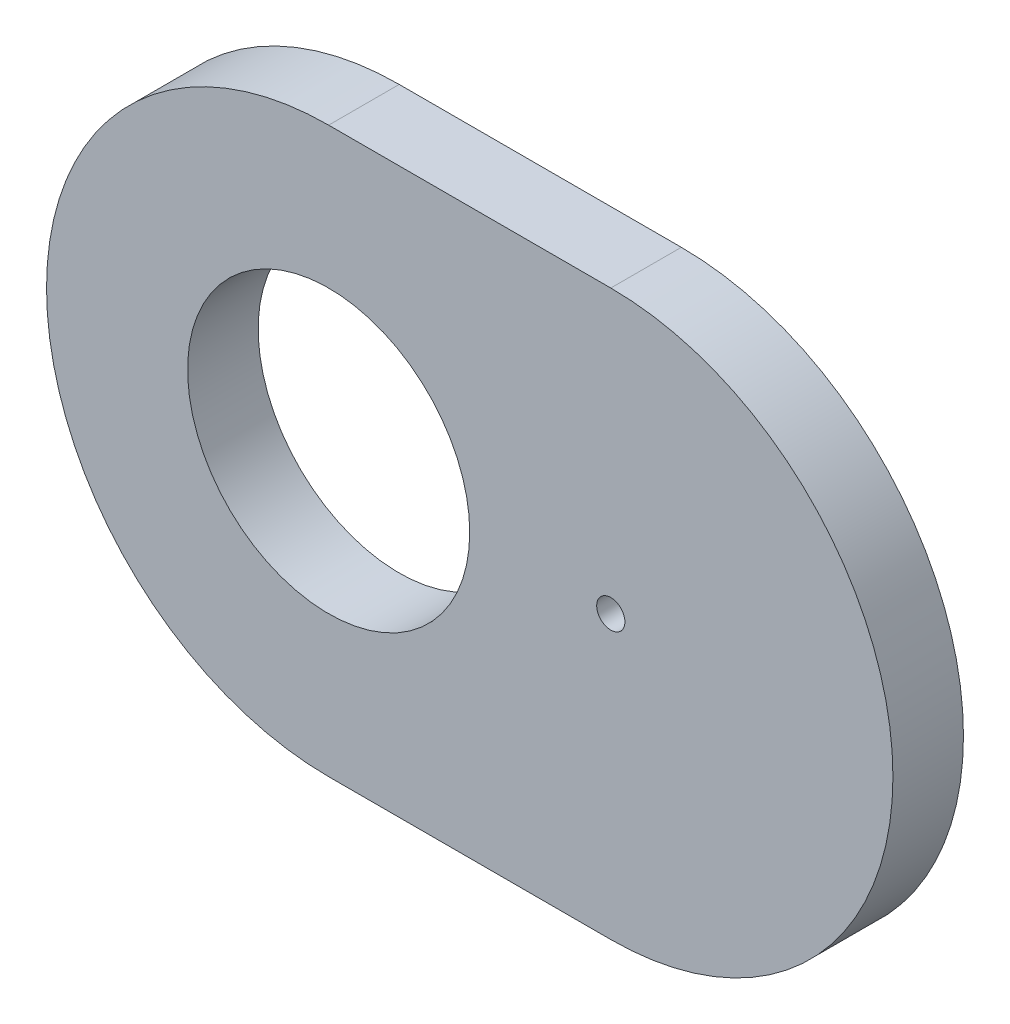
ISO-10303-21;
HEADER;
FILE_DESCRIPTION(('STEP AP214'),'2;1');
FILE_NAME('part.step','',(''),(''),'','','');
FILE_SCHEMA(('AUTOMOTIVE_DESIGN { 1 0 10303 214 1 1 1 1 }'));
ENDSEC;
DATA;
#1=APPLICATION_CONTEXT('core data for automotive mechanical design processes');
#2=APPLICATION_PROTOCOL_DEFINITION('international standard','automotive_design',2000,#1);
#3=PRODUCT_CONTEXT('',#1,'mechanical');
#4=PRODUCT('Part','Part','',(#3));
#5=PRODUCT_RELATED_PRODUCT_CATEGORY('part','',(#4));
#6=PRODUCT_DEFINITION_FORMATION('','',#4);
#7=PRODUCT_DEFINITION_CONTEXT('part definition',#1,'design');
#8=PRODUCT_DEFINITION('design','',#6,#7);
#9=PRODUCT_DEFINITION_SHAPE('','',#8);
#10=(LENGTH_UNIT() NAMED_UNIT(*) SI_UNIT(.MILLI.,.METRE.));
#11=(NAMED_UNIT(*) PLANE_ANGLE_UNIT() SI_UNIT($,.RADIAN.));
#12=(NAMED_UNIT(*) SI_UNIT($,.STERADIAN.) SOLID_ANGLE_UNIT());
#13=UNCERTAINTY_MEASURE_WITH_UNIT(LENGTH_MEASURE(1.E-05),#10,'distance_accuracy_value','');
#14=(GEOMETRIC_REPRESENTATION_CONTEXT(3) GLOBAL_UNCERTAINTY_ASSIGNED_CONTEXT((#13)) GLOBAL_UNIT_ASSIGNED_CONTEXT((#10,
#11,#12)) REPRESENTATION_CONTEXT('',''));
#15=CARTESIAN_POINT('',(0.,0.,0.));
#16=DIRECTION('',(0.,0.,1.));
#17=DIRECTION('',(1.,0.,0.));
#18=AXIS2_PLACEMENT_3D('',#15,#16,#17);
#19=CARTESIAN_POINT('',(-1.03476248038476,-48.4654075800093,6.35));
#20=DIRECTION('',(0.,0.,-1.));
#21=DIRECTION('',(-1.,0.,0.));
#22=AXIS2_PLACEMENT_3D('',#19,#20,#21);
#23=CYLINDRICAL_SURFACE('',#22,25.4);
#24=CARTESIAN_POINT('',(-1.03476248038476,-48.4654075800093,0.));
#25=DIRECTION('',(0.,0.,1.));
#26=DIRECTION('',(1.,0.,0.));
#27=AXIS2_PLACEMENT_3D('',#24,#25,#26);
#28=CIRCLE('',#27,25.4);
#29=CARTESIAN_POINT('',(-1.03476248038476,-23.0654075800093,0.));
#30=VERTEX_POINT('',#29);
#31=CARTESIAN_POINT('',(-1.03476248038476,-73.8654075800093,0.));
#32=VERTEX_POINT('',#31);
#33=EDGE_CURVE('E588',#30,#32,#28,.T.);
#34=ORIENTED_EDGE('',*,*,#33,.T.);
#35=DIRECTION('',(0.,0.,-1.));
#36=VECTOR('',#35,1.);
#37=CARTESIAN_POINT('',(-1.03476248038476,-73.8654075800093,6.35));
#38=LINE('',#37,#36);
#39=CARTESIAN_POINT('',(-1.03476248038476,-73.8654075800093,6.35));
#40=VERTEX_POINT('',#39);
#41=EDGE_CURVE('E12',#40,#32,#38,.T.);
#42=ORIENTED_EDGE('',*,*,#41,.F.);
#43=CARTESIAN_POINT('',(-1.03476248038476,-48.4654075800093,6.35));
#44=DIRECTION('',(0.,0.,1.));
#45=DIRECTION('',(1.,0.,0.));
#46=AXIS2_PLACEMENT_3D('',#43,#44,#45);
#47=CIRCLE('',#46,25.4);
#48=CARTESIAN_POINT('',(-1.03476248038476,-23.0654075800093,6.35));
#49=VERTEX_POINT('',#48);
#50=EDGE_CURVE('E567',#49,#40,#47,.T.);
#51=ORIENTED_EDGE('',*,*,#50,.F.);
#52=DIRECTION('',(0.,0.,-1.));
#53=VECTOR('',#52,1.);
#54=CARTESIAN_POINT('',(-1.03476248038476,-23.0654075800093,6.35));
#55=LINE('',#54,#53);
#56=EDGE_CURVE('E531',#49,#30,#55,.T.);
#57=ORIENTED_EDGE('',*,*,#56,.T.);
#58=EDGE_LOOP('',(#34,#42,#51,#57));
#59=FACE_BOUND('',#58,.T.);
#60=ADVANCED_FACE('F516',(#59),#23,.T.);
#61=CARTESIAN_POINT('',(-1.03476248038476,-73.8654075800093,6.35));
#62=DIRECTION('',(0.,1.,0.));
#63=DIRECTION('',(0.,0.,1.));
#64=AXIS2_PLACEMENT_3D('',#61,#62,#63);
#65=PLANE('',#64);
#66=DIRECTION('',(1.,0.,0.));
#67=VECTOR('',#66,1.);
#68=CARTESIAN_POINT('',(-1.03476248038476,-73.8654075800093,0.));
#69=LINE('',#68,#67);
#70=CARTESIAN_POINT('',(24.3652375196152,-73.8654075800093,0.));
#71=VERTEX_POINT('',#70);
#72=EDGE_CURVE('E575',#32,#71,#69,.T.);
#73=ORIENTED_EDGE('',*,*,#72,.T.);
#74=DIRECTION('',(0.,0.,-1.));
#75=VECTOR('',#74,1.);
#76=CARTESIAN_POINT('',(24.3652375196152,-73.8654075800093,6.35));
#77=LINE('',#76,#75);
#78=CARTESIAN_POINT('',(24.3652375196152,-73.8654075800093,6.35));
#79=VERTEX_POINT('',#78);
#80=EDGE_CURVE('E524',#79,#71,#77,.T.);
#81=ORIENTED_EDGE('',*,*,#80,.F.);
#82=DIRECTION('',(1.,0.,0.));
#83=VECTOR('',#82,1.);
#84=CARTESIAN_POINT('',(-1.03476248038476,-73.8654075800093,6.35));
#85=LINE('',#84,#83);
#86=EDGE_CURVE('E558',#40,#79,#85,.T.);
#87=ORIENTED_EDGE('',*,*,#86,.F.);
#88=ORIENTED_EDGE('',*,*,#41,.T.);
#89=EDGE_LOOP('',(#73,#81,#87,#88));
#90=FACE_BOUND('',#89,.T.);
#91=ADVANCED_FACE('F571',(#90),#65,.F.);
#92=CARTESIAN_POINT('',(24.3652375196153,-48.4654075800093,6.35));
#93=DIRECTION('',(0.,0.,-1.));
#94=DIRECTION('',(-1.,0.,0.));
#95=AXIS2_PLACEMENT_3D('',#92,#93,#94);
#96=CYLINDRICAL_SURFACE('',#95,25.4);
#97=CARTESIAN_POINT('',(24.3652375196153,-48.4654075800093,0.));
#98=DIRECTION('',(0.,0.,1.));
#99=DIRECTION('',(1.,0.,0.));
#100=AXIS2_PLACEMENT_3D('',#97,#98,#99);
#101=CIRCLE('',#100,25.4);
#102=CARTESIAN_POINT('',(24.3652375196153,-23.0654075800093,0.));
#103=VERTEX_POINT('',#102);
#104=EDGE_CURVE('E595',#71,#103,#101,.T.);
#105=ORIENTED_EDGE('',*,*,#104,.T.);
#106=DIRECTION('',(0.,0.,-1.));
#107=VECTOR('',#106,1.);
#108=CARTESIAN_POINT('',(24.3652375196153,-23.0654075800093,6.35));
#109=LINE('',#108,#107);
#110=CARTESIAN_POINT('',(24.3652375196153,-23.0654075800093,6.35));
#111=VERTEX_POINT('',#110);
#112=EDGE_CURVE('E547',#111,#103,#109,.T.);
#113=ORIENTED_EDGE('',*,*,#112,.F.);
#114=CARTESIAN_POINT('',(24.3652375196153,-48.4654075800093,6.35));
#115=DIRECTION('',(0.,0.,1.));
#116=DIRECTION('',(1.,0.,0.));
#117=AXIS2_PLACEMENT_3D('',#114,#115,#116);
#118=CIRCLE('',#117,25.4);
#119=EDGE_CURVE('E564',#79,#111,#118,.T.);
#120=ORIENTED_EDGE('',*,*,#119,.F.);
#121=ORIENTED_EDGE('',*,*,#80,.T.);
#122=EDGE_LOOP('',(#105,#113,#120,#121));
#123=FACE_BOUND('',#122,.T.);
#124=ADVANCED_FACE('F576',(#123),#96,.T.);
#125=CARTESIAN_POINT('',(-1.03476248038476,-23.0654075800093,6.35));
#126=DIRECTION('',(0.,1.,0.));
#127=DIRECTION('',(0.,0.,1.));
#128=AXIS2_PLACEMENT_3D('',#125,#126,#127);
#129=PLANE('',#128);
#130=DIRECTION('',(1.,0.,0.));
#131=VECTOR('',#130,1.);
#132=CARTESIAN_POINT('',(-1.03476248038476,-23.0654075800093,0.));
#133=LINE('',#132,#131);
#134=EDGE_CURVE('E594',#30,#103,#133,.T.);
#135=ORIENTED_EDGE('',*,*,#134,.F.);
#136=ORIENTED_EDGE('',*,*,#56,.F.);
#137=DIRECTION('',(1.,0.,0.));
#138=VECTOR('',#137,1.);
#139=CARTESIAN_POINT('',(-1.03476248038476,-23.0654075800093,6.35));
#140=LINE('',#139,#138);
#141=EDGE_CURVE('E577',#49,#111,#140,.T.);
#142=ORIENTED_EDGE('',*,*,#141,.T.);
#143=ORIENTED_EDGE('',*,*,#112,.T.);
#144=EDGE_LOOP('',(#135,#136,#142,#143));
#145=FACE_BOUND('',#144,.T.);
#146=ADVANCED_FACE('F670',(#145),#129,.T.);
#147=CARTESIAN_POINT('',(-1.03476248038476,-48.4654075800093,6.35));
#148=DIRECTION('',(0.,0.,1.));
#149=DIRECTION('',(1.,0.,0.));
#150=AXIS2_PLACEMENT_3D('',#147,#148,#149);
#151=PLANE('',#150);
#152=CARTESIAN_POINT('',(24.3652375196153,-48.4654075800093,6.35));
#153=DIRECTION('',(0.,0.,1.));
#154=DIRECTION('',(1.,0.,0.));
#155=AXIS2_PLACEMENT_3D('',#152,#153,#154);
#156=CIRCLE('',#155,1.27);
#157=CARTESIAN_POINT('',(25.6352375196152,-48.4654075800093,6.35));
#158=VERTEX_POINT('',#157);
#159=EDGE_CURVE('E632',#158,#158,#156,.T.);
#160=ORIENTED_EDGE('',*,*,#159,.F.);
#161=EDGE_LOOP('',(#160));
#162=FACE_BOUND('',#161,.T.);
#163=CARTESIAN_POINT('',(-1.03476248038476,-48.4654075800093,6.35));
#164=DIRECTION('',(0.,0.,1.));
#165=DIRECTION('',(1.,0.,0.));
#166=AXIS2_PLACEMENT_3D('',#163,#164,#165);
#167=CIRCLE('',#166,12.7);
#168=CARTESIAN_POINT('',(11.6652375196152,-48.4654075800093,6.35));
#169=VERTEX_POINT('',#168);
#170=EDGE_CURVE('E589',#169,#169,#167,.T.);
#171=ORIENTED_EDGE('',*,*,#170,.F.);
#172=EDGE_LOOP('',(#171));
#173=FACE_BOUND('',#172,.T.);
#174=ORIENTED_EDGE('',*,*,#50,.T.);
#175=ORIENTED_EDGE('',*,*,#86,.T.);
#176=ORIENTED_EDGE('',*,*,#119,.T.);
#177=ORIENTED_EDGE('',*,*,#141,.F.);
#178=EDGE_LOOP('',(#174,#175,#176,#177));
#179=FACE_BOUND('',#178,.T.);
#180=ADVANCED_FACE('F565',(#162,#173,#179),#151,.T.);
#181=CARTESIAN_POINT('',(-1.03476248038476,-48.4654075800093,0.));
#182=DIRECTION('',(0.,0.,1.));
#183=DIRECTION('',(1.,0.,0.));
#184=AXIS2_PLACEMENT_3D('',#181,#182,#183);
#185=PLANE('',#184);
#186=CARTESIAN_POINT('',(24.3652375196153,-48.4654075800093,0.));
#187=DIRECTION('',(0.,0.,1.));
#188=DIRECTION('',(1.,0.,0.));
#189=AXIS2_PLACEMENT_3D('',#186,#187,#188);
#190=CIRCLE('',#189,1.27);
#191=CARTESIAN_POINT('',(25.6352375196152,-48.4654075800093,0.));
#192=VERTEX_POINT('',#191);
#193=EDGE_CURVE('E640',#192,#192,#190,.T.);
#194=ORIENTED_EDGE('',*,*,#193,.T.);
#195=EDGE_LOOP('',(#194));
#196=FACE_BOUND('',#195,.T.);
#197=CARTESIAN_POINT('',(-1.03476248038476,-48.4654075800093,0.));
#198=DIRECTION('',(0.,0.,1.));
#199=DIRECTION('',(1.,0.,0.));
#200=AXIS2_PLACEMENT_3D('',#197,#198,#199);
#201=CIRCLE('',#200,12.7);
#202=CARTESIAN_POINT('',(11.6652375196152,-48.4654075800093,0.));
#203=VERTEX_POINT('',#202);
#204=EDGE_CURVE('E630',#203,#203,#201,.T.);
#205=ORIENTED_EDGE('',*,*,#204,.T.);
#206=EDGE_LOOP('',(#205));
#207=FACE_BOUND('',#206,.T.);
#208=ORIENTED_EDGE('',*,*,#33,.F.);
#209=ORIENTED_EDGE('',*,*,#134,.T.);
#210=ORIENTED_EDGE('',*,*,#104,.F.);
#211=ORIENTED_EDGE('',*,*,#72,.F.);
#212=EDGE_LOOP('',(#208,#209,#210,#211));
#213=FACE_BOUND('',#212,.T.);
#214=ADVANCED_FACE('F648',(#196,#207,#213),#185,.F.);
#215=CARTESIAN_POINT('',(-1.03476248038476,-48.4654075800093,6.35));
#216=DIRECTION('',(0.,0.,-1.));
#217=DIRECTION('',(-1.,0.,0.));
#218=AXIS2_PLACEMENT_3D('',#215,#216,#217);
#219=CYLINDRICAL_SURFACE('',#218,12.7);
#220=ORIENTED_EDGE('',*,*,#170,.T.);
#221=EDGE_LOOP('',(#220));
#222=FACE_BOUND('',#221,.T.);
#223=ORIENTED_EDGE('',*,*,#204,.F.);
#224=EDGE_LOOP('',(#223));
#225=FACE_BOUND('',#224,.T.);
#226=ADVANCED_FACE('F653',(#222,#225),#219,.F.);
#227=CARTESIAN_POINT('',(24.3652375196153,-48.4654075800093,6.35));
#228=DIRECTION('',(0.,0.,-1.));
#229=DIRECTION('',(-1.,0.,0.));
#230=AXIS2_PLACEMENT_3D('',#227,#228,#229);
#231=CYLINDRICAL_SURFACE('',#230,1.27);
#232=ORIENTED_EDGE('',*,*,#159,.T.);
#233=EDGE_LOOP('',(#232));
#234=FACE_BOUND('',#233,.T.);
#235=ORIENTED_EDGE('',*,*,#193,.F.);
#236=EDGE_LOOP('',(#235));
#237=FACE_BOUND('',#236,.T.);
#238=ADVANCED_FACE('F651',(#234,#237),#231,.F.);
#239=CLOSED_SHELL('',(#60,#91,#124,#146,#180,#214,#226,#238));
#240=MANIFOLD_SOLID_BREP('B2',#239);
#241=ADVANCED_BREP_SHAPE_REPRESENTATION('',(#18,#240),#14);
#242=SHAPE_DEFINITION_REPRESENTATION(#9,#241);
ENDSEC;
END-ISO-10303-21;
